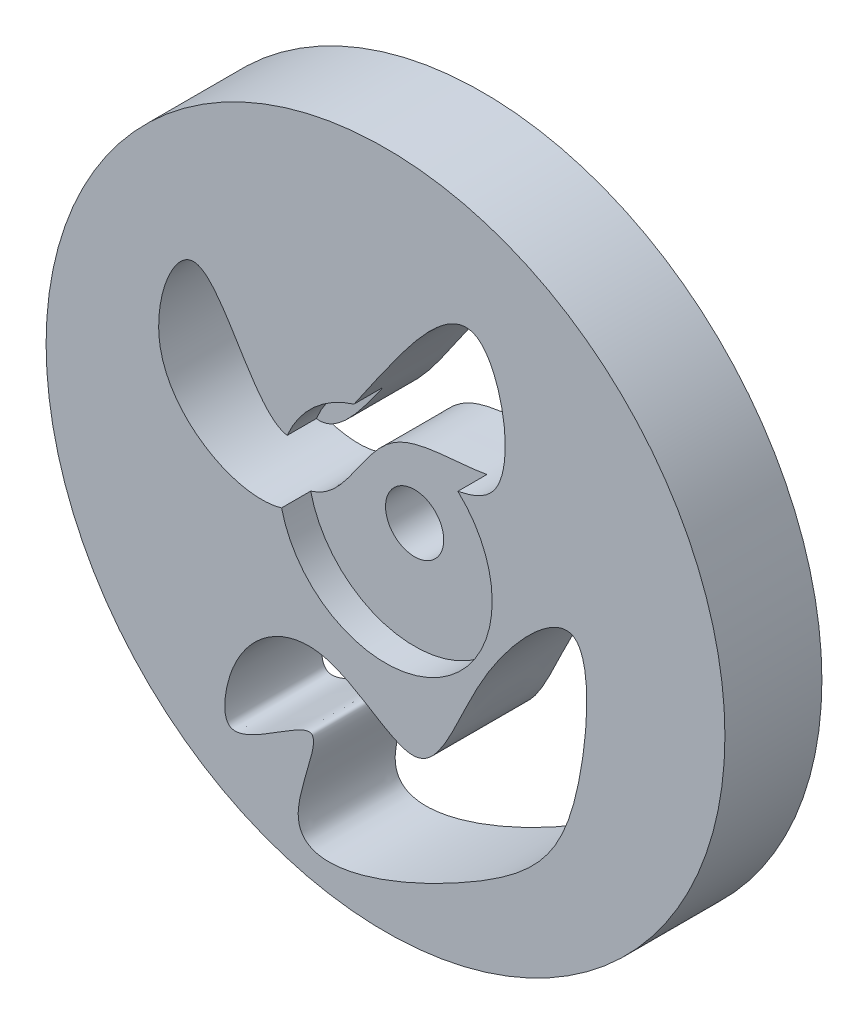
ISO-10303-21;
HEADER;
FILE_DESCRIPTION(('STEP AP214'),'2;1');
FILE_NAME('part.step','',(''),(''),'','','');
FILE_SCHEMA(('AUTOMOTIVE_DESIGN { 1 0 10303 214 1 1 1 1 }'));
ENDSEC;
DATA;
#1=APPLICATION_CONTEXT('core data for automotive mechanical design processes');
#2=APPLICATION_PROTOCOL_DEFINITION('international standard','automotive_design',2000,#1);
#3=PRODUCT_CONTEXT('',#1,'mechanical');
#4=PRODUCT('Part','Part','',(#3));
#5=PRODUCT_RELATED_PRODUCT_CATEGORY('part','',(#4));
#6=PRODUCT_DEFINITION_FORMATION('','',#4);
#7=PRODUCT_DEFINITION_CONTEXT('part definition',#1,'design');
#8=PRODUCT_DEFINITION('design','',#6,#7);
#9=PRODUCT_DEFINITION_SHAPE('','',#8);
#10=(LENGTH_UNIT() NAMED_UNIT(*) SI_UNIT(.MILLI.,.METRE.));
#11=(NAMED_UNIT(*) PLANE_ANGLE_UNIT() SI_UNIT($,.RADIAN.));
#12=(NAMED_UNIT(*) SI_UNIT($,.STERADIAN.) SOLID_ANGLE_UNIT());
#13=UNCERTAINTY_MEASURE_WITH_UNIT(LENGTH_MEASURE(1.E-05),#10,'distance_accuracy_value','');
#14=(GEOMETRIC_REPRESENTATION_CONTEXT(3) GLOBAL_UNCERTAINTY_ASSIGNED_CONTEXT((#13)) GLOBAL_UNIT_ASSIGNED_CONTEXT((#10,
#11,#12)) REPRESENTATION_CONTEXT('',''));
#15=CARTESIAN_POINT('',(0.,0.,0.));
#16=DIRECTION('',(0.,0.,1.));
#17=DIRECTION('',(1.,0.,0.));
#18=AXIS2_PLACEMENT_3D('',#15,#16,#17);
#19=CARTESIAN_POINT('',(19.9249999999996,-7.,10.));
#20=DIRECTION('',(0.,0.,-1.));
#21=DIRECTION('',(-1.,0.,0.));
#22=AXIS2_PLACEMENT_3D('',#19,#20,#21);
#23=CYLINDRICAL_SURFACE('',#22,3.);
#24=CARTESIAN_POINT('',(19.9249999999996,-7.,0.));
#25=DIRECTION('',(0.,0.,1.));
#26=DIRECTION('',(1.,0.,0.));
#27=AXIS2_PLACEMENT_3D('',#24,#25,#26);
#28=CIRCLE('',#27,3.);
#29=CARTESIAN_POINT('',(22.9249999999996,-7.,0.));
#30=VERTEX_POINT('',#29);
#31=EDGE_CURVE('E97',#30,#30,#28,.T.);
#32=ORIENTED_EDGE('',*,*,#31,.F.);
#33=EDGE_LOOP('',(#32));
#34=FACE_BOUND('',#33,.T.);
#35=CARTESIAN_POINT('',(19.9249999999996,-7.,7.));
#36=DIRECTION('',(0.,0.,1.));
#37=DIRECTION('',(1.,0.,0.));
#38=AXIS2_PLACEMENT_3D('',#35,#36,#37);
#39=CIRCLE('',#38,3.);
#40=CARTESIAN_POINT('',(22.9249999999996,-7.,7.));
#41=VERTEX_POINT('',#40);
#42=EDGE_CURVE('E147',#41,#41,#39,.T.);
#43=ORIENTED_EDGE('',*,*,#42,.T.);
#44=EDGE_LOOP('',(#43));
#45=FACE_BOUND('',#44,.T.);
#46=ADVANCED_FACE('F37',(#34,#45),#23,.F.);
#47=CARTESIAN_POINT('',(19.9249999999996,-7.,10.));
#48=DIRECTION('',(0.,0.,1.));
#49=DIRECTION('',(1.,0.,0.));
#50=AXIS2_PLACEMENT_3D('',#47,#48,#49);
#51=PLANE('',#50);
#52=CARTESIAN_POINT('',(19.9249999999996,-7.,10.));
#53=DIRECTION('',(0.,0.,1.));
#54=DIRECTION('',(1.,0.,0.));
#55=AXIS2_PLACEMENT_3D('',#52,#53,#54);
#56=CIRCLE('',#55,11.);
#57=CARTESIAN_POINT('',(16.6778422180636,3.50980334445952,10.));
#58=VERTEX_POINT('',#57);
#59=CARTESIAN_POINT('',(9.78984639298546,-2.72464488466415,10.));
#60=VERTEX_POINT('',#59);
#61=EDGE_CURVE('E85',#58,#60,#56,.T.);
#62=ORIENTED_EDGE('',*,*,#61,.F.);
#63=CARTESIAN_POINT('',(-3.30378462527018,-1.41137668214195,10.));
#64=CARTESIAN_POINT('',(-2.12737466319417,-7.69245939132555,10.));
#65=CARTESIAN_POINT('',(11.5940978437303,-14.0334661890732,10.));
#66=CARTESIAN_POINT('',(16.2636769473954,3.1048593562965,10.));
#67=CARTESIAN_POINT('',(34.8931373421532,-1.93269180128034,10.));
#68=CARTESIAN_POINT('',(30.0042959058954,24.1479812161658,10.));
#69=CARTESIAN_POINT('',(18.6841499627685,5.9191722391468,10.));
#70=CARTESIAN_POINT('',(8.10716362795123,-8.1643184944058,10.));
#71=CARTESIAN_POINT('',(0.792352575724668,15.1406890889856,10.));
#72=CARTESIAN_POINT('',(-4.06062242818802,2.62952826665225,10.));
#73=CARTESIAN_POINT('',(-3.30378462527018,-1.41137668214195,10.));
#74=B_SPLINE_CURVE_WITH_KNOTS('',3,(#63,#64,#65,#66,#67,#68,#69,#70,#71,#72,#73),.UNSPECIFIED.,
.T.,.F.,(4,1,1,1,1,1,1,1,4),(0.,0.147638919938667,0.258869824577169,0.388549924013756,
0.508996172311627,0.679213038621472,0.768975012953032,0.905017196901021,1.),.UNSPECIFIED.);
#75=CARTESIAN_POINT('',(27.3866773007238,1.08228753880091,10.));
#76=VERTEX_POINT('',#75);
#77=EDGE_CURVE('E92',#76,#58,#74,.T.);
#78=ORIENTED_EDGE('',*,*,#77,.F.);
#79=CARTESIAN_POINT('',(9.21010892319446,-9.48819396595241,10.));
#80=VERTEX_POINT('',#79);
#81=EDGE_CURVE('E76',#80,#76,#56,.T.);
#82=ORIENTED_EDGE('',*,*,#81,.F.);
#83=EDGE_CURVE('E98',#60,#80,#74,.T.);
#84=ORIENTED_EDGE('',*,*,#83,.F.);
#85=EDGE_LOOP('',(#62,#78,#82,#84));
#86=FACE_BOUND('',#85,.T.);
#87=CARTESIAN_POINT('',(19.9249999999996,-7.,10.));
#88=DIRECTION('',(0.,0.,1.));
#89=DIRECTION('',(1.,0.,0.));
#90=AXIS2_PLACEMENT_3D('',#87,#88,#89);
#91=CIRCLE('',#90,35.);
#92=CARTESIAN_POINT('',(54.9249999999996,-7.,10.));
#93=VERTEX_POINT('',#92);
#94=EDGE_CURVE('E169',#93,#93,#91,.T.);
#95=ORIENTED_EDGE('',*,*,#94,.T.);
#96=EDGE_LOOP('',(#95));
#97=FACE_BOUND('',#96,.T.);
#98=CARTESIAN_POINT('',(3.84346370706421,-27.2463844155342,10.));
#99=CARTESIAN_POINT('',(3.28211008477424,-29.0243910712493,10.));
#100=CARTESIAN_POINT('',(2.68762160563622,-35.3293627563138,10.));
#101=CARTESIAN_POINT('',(15.8304912069005,-23.1540933579814,10.));
#102=CARTESIAN_POINT('',(5.80641814509434,-43.9951677302814,10.));
#103=CARTESIAN_POINT('',(33.0952620831717,-32.3609864880009,10.));
#104=CARTESIAN_POINT('',(40.2566689045569,-23.3168894091259,10.));
#105=CARTESIAN_POINT('',(41.7244815088449,-0.209082999293812,10.));
#106=CARTESIAN_POINT('',(28.4672166101958,-14.0130102965831,10.));
#107=CARTESIAN_POINT('',(24.626923004113,-29.2263120832627,10.));
#108=CARTESIAN_POINT('',(13.0158830057795,-17.2751358782384,10.));
#109=CARTESIAN_POINT('',(5.33566810629867,-22.5200421453923,10.));
#110=CARTESIAN_POINT('',(3.84346370706421,-27.2463844155342,10.));
#111=B_SPLINE_CURVE_WITH_KNOTS('',3,(#98,#99,#100,#101,#102,#103,#104,#105,#106,#107,#108,#109,
#110),.UNSPECIFIED.,.T.,.F.,(4,1,1,1,1,1,1,1,1,1,4),(0.,0.0374028253251187,0.114957550082788,
0.180670133858667,0.337709459491225,0.486656885419784,0.598420098951954,0.703905929112408,
0.813392908619479,0.900574863548115,1.),.UNSPECIFIED.);
#112=CARTESIAN_POINT('',(3.84346370706421,-27.2463844155342,10.));
#113=VERTEX_POINT('',#112);
#114=EDGE_CURVE('E146',#113,#113,#111,.T.);
#115=ORIENTED_EDGE('',*,*,#114,.F.);
#116=EDGE_LOOP('',(#115));
#117=FACE_BOUND('',#116,.T.);
#118=ADVANCED_FACE('F95',(#86,#97,#117),#51,.T.);
#119=CARTESIAN_POINT('',(19.9249999999996,-7.,0.));
#120=DIRECTION('',(0.,0.,1.));
#121=DIRECTION('',(1.,0.,0.));
#122=AXIS2_PLACEMENT_3D('',#119,#120,#121);
#123=PLANE('',#122);
#124=CARTESIAN_POINT('',(19.9249999999996,-7.,0.));
#125=DIRECTION('',(0.,0.,1.));
#126=DIRECTION('',(1.,0.,0.));
#127=AXIS2_PLACEMENT_3D('',#124,#125,#126);
#128=CIRCLE('',#127,35.);
#129=CARTESIAN_POINT('',(54.9249999999996,-7.,0.));
#130=VERTEX_POINT('',#129);
#131=EDGE_CURVE('E101',#130,#130,#128,.T.);
#132=ORIENTED_EDGE('',*,*,#131,.F.);
#133=EDGE_LOOP('',(#132));
#134=FACE_BOUND('',#133,.T.);
#135=ORIENTED_EDGE('',*,*,#31,.T.);
#136=EDGE_LOOP('',(#135));
#137=FACE_BOUND('',#136,.T.);
#138=CARTESIAN_POINT('',(-3.30378462527018,-1.41137668214195,0.));
#139=CARTESIAN_POINT('',(-2.12737466319417,-7.69245939132555,0.));
#140=CARTESIAN_POINT('',(11.5940978437303,-14.0334661890732,0.));
#141=CARTESIAN_POINT('',(16.2636769473954,3.1048593562965,0.));
#142=CARTESIAN_POINT('',(34.8931373421532,-1.93269180128034,0.));
#143=CARTESIAN_POINT('',(30.0042959058954,24.1479812161658,0.));
#144=CARTESIAN_POINT('',(18.6841499627685,5.9191722391468,0.));
#145=CARTESIAN_POINT('',(8.10716362795123,-8.1643184944058,0.));
#146=CARTESIAN_POINT('',(0.792352575724668,15.1406890889856,0.));
#147=CARTESIAN_POINT('',(-4.06062242818802,2.62952826665225,0.));
#148=CARTESIAN_POINT('',(-3.30378462527018,-1.41137668214195,0.));
#149=B_SPLINE_CURVE_WITH_KNOTS('',3,(#138,#139,#140,#141,#142,#143,#144,#145,#146,#147,#148),
.UNSPECIFIED.,.T.,.F.,(4,1,1,1,1,1,1,1,4),(0.,0.147638919938667,0.258869824577169,
0.388549924013756,0.508996172311627,0.679213038621472,0.768975012953032,0.905017196901021,1.),.UNSPECIFIED.);
#150=CARTESIAN_POINT('',(-3.30378462527018,-1.41137668214195,0.));
#151=VERTEX_POINT('',#150);
#152=EDGE_CURVE('E103',#151,#151,#149,.T.);
#153=ORIENTED_EDGE('',*,*,#152,.T.);
#154=EDGE_LOOP('',(#153));
#155=FACE_BOUND('',#154,.T.);
#156=CARTESIAN_POINT('',(3.84346370706421,-27.2463844155342,0.));
#157=CARTESIAN_POINT('',(3.28211008477424,-29.0243910712493,0.));
#158=CARTESIAN_POINT('',(2.68762160563622,-35.3293627563138,0.));
#159=CARTESIAN_POINT('',(15.8304912069005,-23.1540933579814,0.));
#160=CARTESIAN_POINT('',(5.80641814509434,-43.9951677302814,0.));
#161=CARTESIAN_POINT('',(33.0952620831717,-32.3609864880009,0.));
#162=CARTESIAN_POINT('',(40.2566689045569,-23.3168894091259,0.));
#163=CARTESIAN_POINT('',(41.7244815088449,-0.209082999293812,0.));
#164=CARTESIAN_POINT('',(28.4672166101958,-14.0130102965831,0.));
#165=CARTESIAN_POINT('',(24.626923004113,-29.2263120832627,0.));
#166=CARTESIAN_POINT('',(13.0158830057795,-17.2751358782384,0.));
#167=CARTESIAN_POINT('',(5.33566810629867,-22.5200421453923,0.));
#168=CARTESIAN_POINT('',(3.84346370706421,-27.2463844155342,0.));
#169=B_SPLINE_CURVE_WITH_KNOTS('',3,(#156,#157,#158,#159,#160,#161,#162,#163,#164,#165,#166,
#167,#168),.UNSPECIFIED.,.T.,.F.,(4,1,1,1,1,1,1,1,1,1,4),(0.,0.0374028253251187,
0.114957550082788,0.180670133858667,0.337709459491225,0.486656885419784,0.598420098951954,
0.703905929112408,0.813392908619479,0.900574863548115,1.),.UNSPECIFIED.);
#170=CARTESIAN_POINT('',(3.84346370706421,-27.2463844155342,0.));
#171=VERTEX_POINT('',#170);
#172=EDGE_CURVE('E109',#171,#171,#169,.T.);
#173=ORIENTED_EDGE('',*,*,#172,.T.);
#174=EDGE_LOOP('',(#173));
#175=FACE_BOUND('',#174,.T.);
#176=ADVANCED_FACE('F128',(#134,#137,#155,#175),#123,.F.);
#177=CARTESIAN_POINT('',(19.9249999999996,-7.,10.));
#178=DIRECTION('',(0.,0.,-1.));
#179=DIRECTION('',(-1.,0.,0.));
#180=AXIS2_PLACEMENT_3D('',#177,#178,#179);
#181=CYLINDRICAL_SURFACE('',#180,35.);
#182=ORIENTED_EDGE('',*,*,#94,.F.);
#183=EDGE_LOOP('',(#182));
#184=FACE_BOUND('',#183,.T.);
#185=ORIENTED_EDGE('',*,*,#131,.T.);
#186=EDGE_LOOP('',(#185));
#187=FACE_BOUND('',#186,.T.);
#188=ADVANCED_FACE('F39',(#184,#187),#181,.T.);
#189=DIRECTION('',(0.,0.,-1.));
#190=VECTOR('',#189,1.);
#191=SURFACE_OF_LINEAR_EXTRUSION('',#74,#190);
#192=DIRECTION('',(0.,0.,-1.));
#193=VECTOR('',#192,1.);
#194=CARTESIAN_POINT('',(9.21010892319446,-9.48819396595242,10.));
#195=LINE('',#194,#193);
#196=CARTESIAN_POINT('',(9.21010892319446,-9.48819396595241,7.));
#197=VERTEX_POINT('',#196);
#198=EDGE_CURVE('E11',#197,#80,#195,.F.);
#199=ORIENTED_EDGE('',*,*,#198,.F.);
#200=CARTESIAN_POINT('',(-3.30378462527018,-1.41137668214195,7.));
#201=CARTESIAN_POINT('',(-2.12737466319417,-7.69245939132555,7.));
#202=CARTESIAN_POINT('',(11.5940978437303,-14.0334661890732,7.));
#203=CARTESIAN_POINT('',(16.2636769473954,3.1048593562965,7.));
#204=CARTESIAN_POINT('',(34.8931373421532,-1.93269180128034,7.));
#205=CARTESIAN_POINT('',(30.0042959058954,24.1479812161658,7.));
#206=CARTESIAN_POINT('',(18.6841499627685,5.9191722391468,7.));
#207=CARTESIAN_POINT('',(8.10716362795123,-8.1643184944058,7.));
#208=CARTESIAN_POINT('',(0.792352575724668,15.1406890889856,7.));
#209=CARTESIAN_POINT('',(-4.06062242818802,2.62952826665225,7.));
#210=CARTESIAN_POINT('',(-3.30378462527018,-1.41137668214195,7.));
#211=B_SPLINE_CURVE_WITH_KNOTS('',3,(#200,#201,#202,#203,#204,#205,#206,#207,#208,#209,#210),
.UNSPECIFIED.,.T.,.F.,(4,1,1,1,1,1,1,1,4),(0.,0.147638919938667,0.258869824577169,
0.388549924013756,0.508996172311627,0.679213038621472,0.768975012953032,0.905017196901021,1.),.UNSPECIFIED.);
#212=CARTESIAN_POINT('',(27.3866773007238,1.08228753880091,7.));
#213=VERTEX_POINT('',#212);
#214=EDGE_CURVE('E93',#197,#213,#211,.T.);
#215=ORIENTED_EDGE('',*,*,#214,.T.);
#216=DIRECTION('',(0.,0.,-1.));
#217=VECTOR('',#216,1.);
#218=CARTESIAN_POINT('',(27.3866773007238,1.08228753880091,10.));
#219=LINE('',#218,#217);
#220=EDGE_CURVE('E45',#76,#213,#219,.T.);
#221=ORIENTED_EDGE('',*,*,#220,.F.);
#222=ORIENTED_EDGE('',*,*,#77,.T.);
#223=DIRECTION('',(0.,0.,-1.));
#224=VECTOR('',#223,1.);
#225=CARTESIAN_POINT('',(16.6778422180636,3.50980334445951,10.));
#226=LINE('',#225,#224);
#227=CARTESIAN_POINT('',(16.6778422180636,3.50980334445952,7.));
#228=VERTEX_POINT('',#227);
#229=EDGE_CURVE('E165',#228,#58,#226,.F.);
#230=ORIENTED_EDGE('',*,*,#229,.F.);
#231=CARTESIAN_POINT('',(9.78984639298545,-2.72464488466414,7.));
#232=VERTEX_POINT('',#231);
#233=EDGE_CURVE('E166',#228,#232,#211,.T.);
#234=ORIENTED_EDGE('',*,*,#233,.T.);
#235=DIRECTION('',(0.,0.,-1.));
#236=VECTOR('',#235,1.);
#237=CARTESIAN_POINT('',(9.78984639298546,-2.72464488466415,10.));
#238=LINE('',#237,#236);
#239=EDGE_CURVE('E163',#60,#232,#238,.T.);
#240=ORIENTED_EDGE('',*,*,#239,.F.);
#241=ORIENTED_EDGE('',*,*,#83,.T.);
#242=EDGE_LOOP('',(#199,#215,#221,#222,#230,#234,#240,#241));
#243=FACE_BOUND('',#242,.T.);
#244=ORIENTED_EDGE('',*,*,#152,.F.);
#245=EDGE_LOOP('',(#244));
#246=FACE_BOUND('',#245,.T.);
#247=ADVANCED_FACE('F89',(#243,#246),#191,.T.);
#248=DIRECTION('',(0.,0.,-1.));
#249=VECTOR('',#248,1.);
#250=SURFACE_OF_LINEAR_EXTRUSION('',#111,#249);
#251=ORIENTED_EDGE('',*,*,#114,.T.);
#252=EDGE_LOOP('',(#251));
#253=FACE_BOUND('',#252,.T.);
#254=ORIENTED_EDGE('',*,*,#172,.F.);
#255=EDGE_LOOP('',(#254));
#256=FACE_BOUND('',#255,.T.);
#257=ADVANCED_FACE('F122',(#253,#256),#250,.T.);
#258=CARTESIAN_POINT('',(19.9249999999996,-7.,7.));
#259=DIRECTION('',(0.,0.,1.));
#260=DIRECTION('',(1.,0.,0.));
#261=AXIS2_PLACEMENT_3D('',#258,#259,#260);
#262=PLANE('',#261);
#263=CARTESIAN_POINT('',(19.9249999999996,-7.,7.));
#264=DIRECTION('',(0.,0.,1.));
#265=DIRECTION('',(1.,0.,0.));
#266=AXIS2_PLACEMENT_3D('',#263,#264,#265);
#267=CIRCLE('',#266,11.);
#268=EDGE_CURVE('E58',#228,#232,#267,.T.);
#269=ORIENTED_EDGE('',*,*,#268,.T.);
#270=ORIENTED_EDGE('',*,*,#233,.F.);
#271=EDGE_LOOP('',(#269,#270));
#272=FACE_BOUND('',#271,.T.);
#273=ADVANCED_FACE('F185',(#272),#262,.T.);
#274=CARTESIAN_POINT('',(19.9249999999996,-7.,7.));
#275=DIRECTION('',(0.,0.,1.));
#276=DIRECTION('',(1.,0.,0.));
#277=AXIS2_PLACEMENT_3D('',#274,#275,#276);
#278=CYLINDRICAL_SURFACE('',#277,11.);
#279=ORIENTED_EDGE('',*,*,#229,.T.);
#280=ORIENTED_EDGE('',*,*,#61,.T.);
#281=ORIENTED_EDGE('',*,*,#239,.T.);
#282=ORIENTED_EDGE('',*,*,#268,.F.);
#283=EDGE_LOOP('',(#279,#280,#281,#282));
#284=FACE_BOUND('',#283,.T.);
#285=ADVANCED_FACE('F162',(#284),#278,.F.);
#286=ORIENTED_EDGE('',*,*,#198,.T.);
#287=ORIENTED_EDGE('',*,*,#81,.T.);
#288=ORIENTED_EDGE('',*,*,#220,.T.);
#289=EDGE_CURVE('E51',#197,#213,#267,.T.);
#290=ORIENTED_EDGE('',*,*,#289,.F.);
#291=EDGE_LOOP('',(#286,#287,#288,#290));
#292=FACE_BOUND('',#291,.T.);
#293=ADVANCED_FACE('F78',(#292),#278,.F.);
#294=ORIENTED_EDGE('',*,*,#42,.F.);
#295=EDGE_LOOP('',(#294));
#296=FACE_BOUND('',#295,.T.);
#297=ORIENTED_EDGE('',*,*,#289,.T.);
#298=ORIENTED_EDGE('',*,*,#214,.F.);
#299=EDGE_LOOP('',(#297,#298));
#300=FACE_BOUND('',#299,.T.);
#301=ADVANCED_FACE('F190',(#296,#300),#262,.T.);
#302=CLOSED_SHELL('',(#46,#118,#176,#188,#247,#257,#273,#285,#293,#301));
#303=MANIFOLD_SOLID_BREP('B2',#302);
#304=ADVANCED_BREP_SHAPE_REPRESENTATION('',(#18,#303),#14);
#305=SHAPE_DEFINITION_REPRESENTATION(#9,#304);
ENDSEC;
END-ISO-10303-21;
